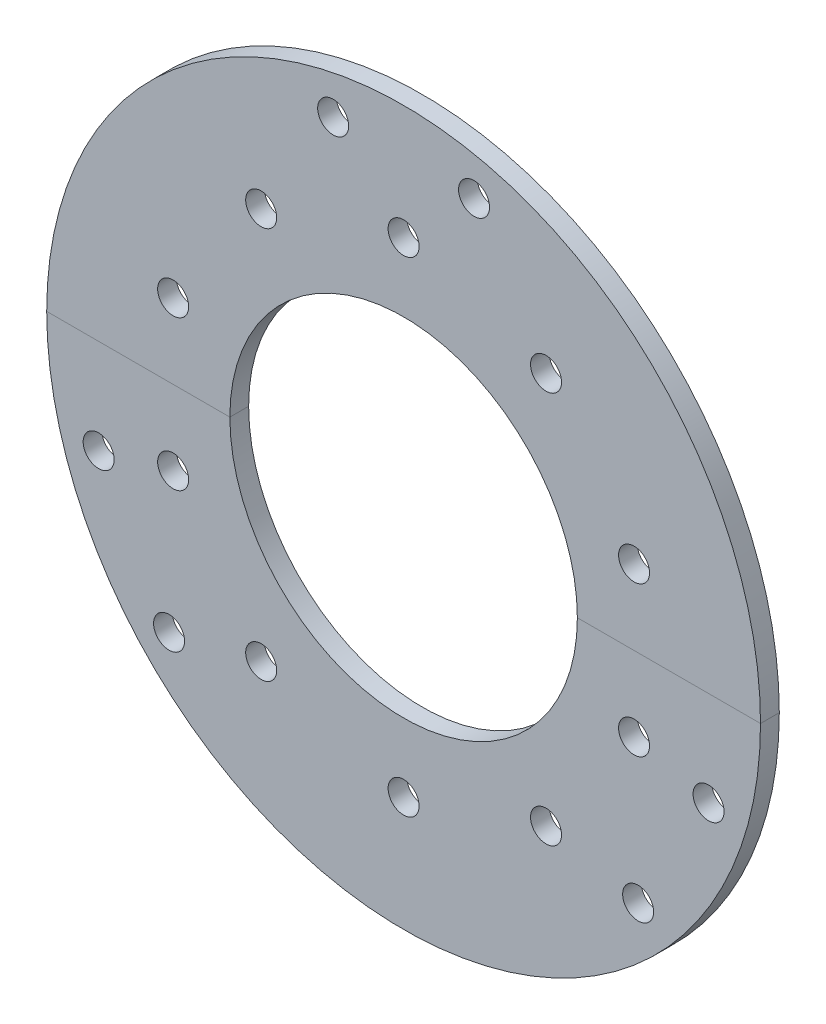
ISO-10303-21;
HEADER;
FILE_DESCRIPTION(('STEP AP214'),'2;1');
FILE_NAME('part.step','',(''),(''),'','','');
FILE_SCHEMA(('AUTOMOTIVE_DESIGN { 1 0 10303 214 1 1 1 1 }'));
ENDSEC;
DATA;
#1=APPLICATION_CONTEXT('core data for automotive mechanical design processes');
#2=APPLICATION_PROTOCOL_DEFINITION('international standard','automotive_design',2000,#1);
#3=PRODUCT_CONTEXT('',#1,'mechanical');
#4=PRODUCT('Part','Part','',(#3));
#5=PRODUCT_RELATED_PRODUCT_CATEGORY('part','',(#4));
#6=PRODUCT_DEFINITION_FORMATION('','',#4);
#7=PRODUCT_DEFINITION_CONTEXT('part definition',#1,'design');
#8=PRODUCT_DEFINITION('design','',#6,#7);
#9=PRODUCT_DEFINITION_SHAPE('','',#8);
#10=(LENGTH_UNIT() NAMED_UNIT(*) SI_UNIT(.MILLI.,.METRE.));
#11=(NAMED_UNIT(*) PLANE_ANGLE_UNIT() SI_UNIT($,.RADIAN.));
#12=(NAMED_UNIT(*) SI_UNIT($,.STERADIAN.) SOLID_ANGLE_UNIT());
#13=UNCERTAINTY_MEASURE_WITH_UNIT(LENGTH_MEASURE(1.E-05),#10,'distance_accuracy_value','');
#14=(GEOMETRIC_REPRESENTATION_CONTEXT(3) GLOBAL_UNCERTAINTY_ASSIGNED_CONTEXT((#13)) GLOBAL_UNIT_ASSIGNED_CONTEXT((#10,
#11,#12)) REPRESENTATION_CONTEXT('',''));
#15=CARTESIAN_POINT('',(0.,0.,0.));
#16=DIRECTION('',(0.,0.,1.));
#17=DIRECTION('',(1.,0.,0.));
#18=AXIS2_PLACEMENT_3D('',#15,#16,#17);
#19=CARTESIAN_POINT('',(0.,0.,0.));
#20=DIRECTION('',(0.,1.,0.));
#21=DIRECTION('',(0.,0.,1.));
#22=AXIS2_PLACEMENT_3D('',#19,#20,#21);
#23=PLANE('',#22);
#24=DIRECTION('',(-1.,0.,0.));
#25=VECTOR('',#24,1.);
#26=CARTESIAN_POINT('',(0.,0.,4.));
#27=LINE('',#26,#25);
#28=CARTESIAN_POINT('',(76.,0.,4.));
#29=VERTEX_POINT('',#28);
#30=CARTESIAN_POINT('',(37.,0.,4.));
#31=VERTEX_POINT('',#30);
#32=EDGE_CURVE('E99',#29,#31,#27,.T.);
#33=ORIENTED_EDGE('',*,*,#32,.F.);
#34=DIRECTION('',(0.,0.,-1.));
#35=VECTOR('',#34,1.);
#36=CARTESIAN_POINT('',(76.,0.,4.));
#37=LINE('',#36,#35);
#38=CARTESIAN_POINT('',(76.,0.,0.));
#39=VERTEX_POINT('',#38);
#40=EDGE_CURVE('E109',#29,#39,#37,.T.);
#41=ORIENTED_EDGE('',*,*,#40,.T.);
#42=DIRECTION('',(-1.,0.,0.));
#43=VECTOR('',#42,1.);
#44=CARTESIAN_POINT('',(0.,0.,0.));
#45=LINE('',#44,#43);
#46=CARTESIAN_POINT('',(37.,0.,0.));
#47=VERTEX_POINT('',#46);
#48=EDGE_CURVE('E111',#39,#47,#45,.T.);
#49=ORIENTED_EDGE('',*,*,#48,.T.);
#50=DIRECTION('',(0.,0.,-1.));
#51=VECTOR('',#50,1.);
#52=CARTESIAN_POINT('',(37.,0.,4.));
#53=LINE('',#52,#51);
#54=EDGE_CURVE('E69',#31,#47,#53,.T.);
#55=ORIENTED_EDGE('',*,*,#54,.F.);
#56=EDGE_LOOP('',(#33,#41,#49,#55));
#57=FACE_BOUND('',#56,.T.);
#58=ADVANCED_FACE('F51',(#57),#23,.T.);
#59=CARTESIAN_POINT('',(-37.,0.,0.));
#60=VERTEX_POINT('',#59);
#61=CARTESIAN_POINT('',(-76.,0.,0.));
#62=VERTEX_POINT('',#61);
#63=EDGE_CURVE('E116',#60,#62,#45,.T.);
#64=ORIENTED_EDGE('',*,*,#63,.T.);
#65=DIRECTION('',(0.,0.,-1.));
#66=VECTOR('',#65,1.);
#67=CARTESIAN_POINT('',(-76.,0.,4.));
#68=LINE('',#67,#66);
#69=CARTESIAN_POINT('',(-76.,0.,4.));
#70=VERTEX_POINT('',#69);
#71=EDGE_CURVE('E117',#62,#70,#68,.F.);
#72=ORIENTED_EDGE('',*,*,#71,.T.);
#73=CARTESIAN_POINT('',(-37.,0.,4.));
#74=VERTEX_POINT('',#73);
#75=EDGE_CURVE('E100',#74,#70,#27,.T.);
#76=ORIENTED_EDGE('',*,*,#75,.F.);
#77=DIRECTION('',(0.,0.,-1.));
#78=VECTOR('',#77,1.);
#79=CARTESIAN_POINT('',(-37.,0.,4.));
#80=LINE('',#79,#78);
#81=EDGE_CURVE('E77',#60,#74,#80,.F.);
#82=ORIENTED_EDGE('',*,*,#81,.F.);
#83=EDGE_LOOP('',(#64,#72,#76,#82));
#84=FACE_BOUND('',#83,.T.);
#85=ADVANCED_FACE('F229',(#84),#23,.T.);
#86=CARTESIAN_POINT('',(49.0745162408297,-15.9452769097482,4.));
#87=DIRECTION('',(0.,0.,-1.));
#88=DIRECTION('',(-1.,0.,0.));
#89=AXIS2_PLACEMENT_3D('',#86,#87,#88);
#90=CYLINDRICAL_SURFACE('',#89,3.3);
#91=CARTESIAN_POINT('',(49.0745162408297,-15.9452769097482,4.));
#92=DIRECTION('',(0.,0.,1.));
#93=DIRECTION('',(1.,0.,0.));
#94=AXIS2_PLACEMENT_3D('',#91,#92,#93);
#95=CIRCLE('',#94,3.3);
#96=CARTESIAN_POINT('',(52.3745162408296,-15.9452769097482,4.));
#97=VERTEX_POINT('',#96);
#98=EDGE_CURVE('E134',#97,#97,#95,.T.);
#99=ORIENTED_EDGE('',*,*,#98,.T.);
#100=EDGE_LOOP('',(#99));
#101=FACE_BOUND('',#100,.T.);
#102=CARTESIAN_POINT('',(49.0745162408297,-15.9452769097482,0.));
#103=DIRECTION('',(0.,0.,1.));
#104=DIRECTION('',(1.,0.,0.));
#105=AXIS2_PLACEMENT_3D('',#102,#103,#104);
#106=CIRCLE('',#105,3.3);
#107=CARTESIAN_POINT('',(52.3745162408296,-15.9452769097482,0.));
#108=VERTEX_POINT('',#107);
#109=EDGE_CURVE('E141',#108,#108,#106,.T.);
#110=ORIENTED_EDGE('',*,*,#109,.F.);
#111=EDGE_LOOP('',(#110));
#112=FACE_BOUND('',#111,.T.);
#113=ADVANCED_FACE('F231',(#101,#112),#90,.F.);
#114=CARTESIAN_POINT('',(30.3297190182908,-41.7452769097479,4.));
#115=DIRECTION('',(0.,0.,-1.));
#116=DIRECTION('',(-1.,0.,0.));
#117=AXIS2_PLACEMENT_3D('',#114,#115,#116);
#118=CYLINDRICAL_SURFACE('',#117,3.29999999999999);
#119=CARTESIAN_POINT('',(30.3297190182908,-41.7452769097479,4.));
#120=DIRECTION('',(0.,0.,1.));
#121=DIRECTION('',(1.,0.,0.));
#122=AXIS2_PLACEMENT_3D('',#119,#120,#121);
#123=CIRCLE('',#122,3.29999999999999);
#124=CARTESIAN_POINT('',(33.6297190182908,-41.7452769097479,4.));
#125=VERTEX_POINT('',#124);
#126=EDGE_CURVE('E149',#125,#125,#123,.T.);
#127=ORIENTED_EDGE('',*,*,#126,.T.);
#128=EDGE_LOOP('',(#127));
#129=FACE_BOUND('',#128,.T.);
#130=CARTESIAN_POINT('',(30.3297190182908,-41.7452769097479,0.));
#131=DIRECTION('',(0.,0.,1.));
#132=DIRECTION('',(1.,0.,0.));
#133=AXIS2_PLACEMENT_3D('',#130,#131,#132);
#134=CIRCLE('',#133,3.29999999999999);
#135=CARTESIAN_POINT('',(33.6297190182908,-41.7452769097479,0.));
#136=VERTEX_POINT('',#135);
#137=EDGE_CURVE('E152',#136,#136,#134,.T.);
#138=ORIENTED_EDGE('',*,*,#137,.F.);
#139=EDGE_LOOP('',(#138));
#140=FACE_BOUND('',#139,.T.);
#141=ADVANCED_FACE('F237',(#129,#140),#118,.F.);
#142=CARTESIAN_POINT('',(-1.06165076729781E-12,-51.6,4.));
#143=DIRECTION('',(0.,0.,-1.));
#144=DIRECTION('',(-1.,0.,0.));
#145=AXIS2_PLACEMENT_3D('',#142,#143,#144);
#146=CYLINDRICAL_SURFACE('',#145,3.30000000000001);
#147=CARTESIAN_POINT('',(-1.06165076729781E-12,-51.6,4.));
#148=DIRECTION('',(0.,0.,1.));
#149=DIRECTION('',(1.,0.,0.));
#150=AXIS2_PLACEMENT_3D('',#147,#148,#149);
#151=CIRCLE('',#150,3.30000000000001);
#152=CARTESIAN_POINT('',(3.29999999999894,-51.6,4.));
#153=VERTEX_POINT('',#152);
#154=EDGE_CURVE('E156',#153,#153,#151,.T.);
#155=ORIENTED_EDGE('',*,*,#154,.T.);
#156=EDGE_LOOP('',(#155));
#157=FACE_BOUND('',#156,.T.);
#158=CARTESIAN_POINT('',(-1.06165076729781E-12,-51.6,0.));
#159=DIRECTION('',(0.,0.,1.));
#160=DIRECTION('',(1.,0.,0.));
#161=AXIS2_PLACEMENT_3D('',#158,#159,#160);
#162=CIRCLE('',#161,3.30000000000001);
#163=CARTESIAN_POINT('',(3.29999999999894,-51.6,0.));
#164=VERTEX_POINT('',#163);
#165=EDGE_CURVE('E160',#164,#164,#162,.T.);
#166=ORIENTED_EDGE('',*,*,#165,.F.);
#167=EDGE_LOOP('',(#166));
#168=FACE_BOUND('',#167,.T.);
#169=ADVANCED_FACE('F306',(#157,#168),#146,.F.);
#170=CARTESIAN_POINT('',(-30.329719018292,-41.7452769097471,4.));
#171=DIRECTION('',(0.,0.,-1.));
#172=DIRECTION('',(-1.,0.,0.));
#173=AXIS2_PLACEMENT_3D('',#170,#171,#172);
#174=CYLINDRICAL_SURFACE('',#173,3.3);
#175=CARTESIAN_POINT('',(-30.329719018292,-41.7452769097471,4.));
#176=DIRECTION('',(0.,0.,1.));
#177=DIRECTION('',(1.,0.,0.));
#178=AXIS2_PLACEMENT_3D('',#175,#176,#177);
#179=CIRCLE('',#178,3.3);
#180=CARTESIAN_POINT('',(-27.029719018292,-41.7452769097471,4.));
#181=VERTEX_POINT('',#180);
#182=EDGE_CURVE('E164',#181,#181,#179,.T.);
#183=ORIENTED_EDGE('',*,*,#182,.T.);
#184=EDGE_LOOP('',(#183));
#185=FACE_BOUND('',#184,.T.);
#186=CARTESIAN_POINT('',(-30.329719018292,-41.7452769097471,0.));
#187=DIRECTION('',(0.,0.,1.));
#188=DIRECTION('',(1.,0.,0.));
#189=AXIS2_PLACEMENT_3D('',#186,#187,#188);
#190=CIRCLE('',#189,3.3);
#191=CARTESIAN_POINT('',(-27.029719018292,-41.7452769097471,0.));
#192=VERTEX_POINT('',#191);
#193=EDGE_CURVE('E168',#192,#192,#190,.T.);
#194=ORIENTED_EDGE('',*,*,#193,.F.);
#195=EDGE_LOOP('',(#194));
#196=FACE_BOUND('',#195,.T.);
#197=ADVANCED_FACE('F298',(#185,#196),#174,.F.);
#198=CARTESIAN_POINT('',(-49.0745162408299,-15.9452769097473,4.));
#199=DIRECTION('',(0.,0.,-1.));
#200=DIRECTION('',(-1.,0.,0.));
#201=AXIS2_PLACEMENT_3D('',#198,#199,#200);
#202=CYLINDRICAL_SURFACE('',#201,3.29999999999998);
#203=CARTESIAN_POINT('',(-49.0745162408299,-15.9452769097473,4.));
#204=DIRECTION('',(0.,0.,1.));
#205=DIRECTION('',(1.,0.,0.));
#206=AXIS2_PLACEMENT_3D('',#203,#204,#205);
#207=CIRCLE('',#206,3.29999999999998);
#208=CARTESIAN_POINT('',(-45.7745162408299,-15.9452769097473,4.));
#209=VERTEX_POINT('',#208);
#210=EDGE_CURVE('E172',#209,#209,#207,.T.);
#211=ORIENTED_EDGE('',*,*,#210,.T.);
#212=EDGE_LOOP('',(#211));
#213=FACE_BOUND('',#212,.T.);
#214=CARTESIAN_POINT('',(-49.0745162408299,-15.9452769097473,0.));
#215=DIRECTION('',(0.,0.,1.));
#216=DIRECTION('',(1.,0.,0.));
#217=AXIS2_PLACEMENT_3D('',#214,#215,#216);
#218=CIRCLE('',#217,3.29999999999998);
#219=CARTESIAN_POINT('',(-45.7745162408299,-15.9452769097473,0.));
#220=VERTEX_POINT('',#219);
#221=EDGE_CURVE('E176',#220,#220,#218,.T.);
#222=ORIENTED_EDGE('',*,*,#221,.F.);
#223=EDGE_LOOP('',(#222));
#224=FACE_BOUND('',#223,.T.);
#225=ADVANCED_FACE('F290',(#213,#224),#202,.F.);
#226=CARTESIAN_POINT('',(64.9390981823357,-20.1720977408143,4.));
#227=DIRECTION('',(0.,0.,-1.));
#228=DIRECTION('',(-1.,0.,0.));
#229=AXIS2_PLACEMENT_3D('',#226,#227,#228);
#230=CYLINDRICAL_SURFACE('',#229,3.30000000000001);
#231=CARTESIAN_POINT('',(64.9390981823357,-20.1720977408143,4.));
#232=DIRECTION('',(0.,0.,1.));
#233=DIRECTION('',(1.,0.,0.));
#234=AXIS2_PLACEMENT_3D('',#231,#232,#233);
#235=CIRCLE('',#234,3.30000000000001);
#236=CARTESIAN_POINT('',(68.2390981823357,-20.1720977408143,4.));
#237=VERTEX_POINT('',#236);
#238=EDGE_CURVE('E180',#237,#237,#235,.T.);
#239=ORIENTED_EDGE('',*,*,#238,.T.);
#240=EDGE_LOOP('',(#239));
#241=FACE_BOUND('',#240,.T.);
#242=CARTESIAN_POINT('',(64.9390981823357,-20.1720977408143,0.));
#243=DIRECTION('',(0.,0.,1.));
#244=DIRECTION('',(1.,0.,0.));
#245=AXIS2_PLACEMENT_3D('',#242,#243,#244);
#246=CIRCLE('',#245,3.30000000000001);
#247=CARTESIAN_POINT('',(68.2390981823357,-20.1720977408143,0.));
#248=VERTEX_POINT('',#247);
#249=EDGE_CURVE('E184',#248,#248,#246,.T.);
#250=ORIENTED_EDGE('',*,*,#249,.F.);
#251=EDGE_LOOP('',(#250));
#252=FACE_BOUND('',#251,.T.);
#253=ADVANCED_FACE('F282',(#241,#252),#230,.F.);
#254=CARTESIAN_POINT('',(49.9390981823357,-46.1528598543474,4.));
#255=DIRECTION('',(0.,0.,-1.));
#256=DIRECTION('',(-1.,0.,0.));
#257=AXIS2_PLACEMENT_3D('',#254,#255,#256);
#258=CYLINDRICAL_SURFACE('',#257,3.3);
#259=CARTESIAN_POINT('',(49.9390981823357,-46.1528598543474,4.));
#260=DIRECTION('',(0.,0.,1.));
#261=DIRECTION('',(1.,0.,0.));
#262=AXIS2_PLACEMENT_3D('',#259,#260,#261);
#263=CIRCLE('',#262,3.3);
#264=CARTESIAN_POINT('',(53.2390981823357,-46.1528598543474,4.));
#265=VERTEX_POINT('',#264);
#266=EDGE_CURVE('E188',#265,#265,#263,.T.);
#267=ORIENTED_EDGE('',*,*,#266,.T.);
#268=EDGE_LOOP('',(#267));
#269=FACE_BOUND('',#268,.T.);
#270=CARTESIAN_POINT('',(49.9390981823357,-46.1528598543474,0.));
#271=DIRECTION('',(0.,0.,1.));
#272=DIRECTION('',(1.,0.,0.));
#273=AXIS2_PLACEMENT_3D('',#270,#271,#272);
#274=CIRCLE('',#273,3.3);
#275=CARTESIAN_POINT('',(53.2390981823357,-46.1528598543474,0.));
#276=VERTEX_POINT('',#275);
#277=EDGE_CURVE('E192',#276,#276,#274,.T.);
#278=ORIENTED_EDGE('',*,*,#277,.F.);
#279=EDGE_LOOP('',(#278));
#280=FACE_BOUND('',#279,.T.);
#281=ADVANCED_FACE('F275',(#269,#280),#258,.F.);
#282=CARTESIAN_POINT('',(-49.9390981823357,-46.1528598543475,4.));
#283=DIRECTION('',(0.,0.,-1.));
#284=DIRECTION('',(-1.,0.,0.));
#285=AXIS2_PLACEMENT_3D('',#282,#283,#284);
#286=CYLINDRICAL_SURFACE('',#285,3.3);
#287=CARTESIAN_POINT('',(-49.9390981823357,-46.1528598543475,4.));
#288=DIRECTION('',(0.,0.,1.));
#289=DIRECTION('',(1.,0.,0.));
#290=AXIS2_PLACEMENT_3D('',#287,#288,#289);
#291=CIRCLE('',#290,3.3);
#292=CARTESIAN_POINT('',(-46.6390981823357,-46.1528598543475,4.));
#293=VERTEX_POINT('',#292);
#294=EDGE_CURVE('E196',#293,#293,#291,.T.);
#295=ORIENTED_EDGE('',*,*,#294,.T.);
#296=EDGE_LOOP('',(#295));
#297=FACE_BOUND('',#296,.T.);
#298=CARTESIAN_POINT('',(-49.9390981823357,-46.1528598543475,0.));
#299=DIRECTION('',(0.,0.,1.));
#300=DIRECTION('',(1.,0.,0.));
#301=AXIS2_PLACEMENT_3D('',#298,#299,#300);
#302=CIRCLE('',#301,3.3);
#303=CARTESIAN_POINT('',(-46.6390981823357,-46.1528598543475,0.));
#304=VERTEX_POINT('',#303);
#305=EDGE_CURVE('E200',#304,#304,#302,.T.);
#306=ORIENTED_EDGE('',*,*,#305,.F.);
#307=EDGE_LOOP('',(#306));
#308=FACE_BOUND('',#307,.T.);
#309=ADVANCED_FACE('F268',(#297,#308),#286,.F.);
#310=CARTESIAN_POINT('',(-64.9390981823357,-20.1720977408143,4.));
#311=DIRECTION('',(0.,0.,-1.));
#312=DIRECTION('',(-1.,0.,0.));
#313=AXIS2_PLACEMENT_3D('',#310,#311,#312);
#314=CYLINDRICAL_SURFACE('',#313,3.3);
#315=CARTESIAN_POINT('',(-64.9390981823357,-20.1720977408143,4.));
#316=DIRECTION('',(0.,0.,1.));
#317=DIRECTION('',(1.,0.,0.));
#318=AXIS2_PLACEMENT_3D('',#315,#316,#317);
#319=CIRCLE('',#318,3.3);
#320=CARTESIAN_POINT('',(-61.6390981823357,-20.1720977408143,4.));
#321=VERTEX_POINT('',#320);
#322=EDGE_CURVE('E61',#321,#321,#319,.T.);
#323=ORIENTED_EDGE('',*,*,#322,.T.);
#324=EDGE_LOOP('',(#323));
#325=FACE_BOUND('',#324,.T.);
#326=CARTESIAN_POINT('',(-64.9390981823357,-20.1720977408143,0.));
#327=DIRECTION('',(0.,0.,1.));
#328=DIRECTION('',(1.,0.,0.));
#329=AXIS2_PLACEMENT_3D('',#326,#327,#328);
#330=CIRCLE('',#329,3.3);
#331=CARTESIAN_POINT('',(-61.6390981823357,-20.1720977408143,0.));
#332=VERTEX_POINT('',#331);
#333=EDGE_CURVE('E13',#332,#332,#330,.T.);
#334=ORIENTED_EDGE('',*,*,#333,.F.);
#335=EDGE_LOOP('',(#334));
#336=FACE_BOUND('',#335,.T.);
#337=ADVANCED_FACE('F241',(#325,#336),#314,.F.);
#338=CARTESIAN_POINT('',(0.,0.,0.));
#339=DIRECTION('',(0.,0.,1.));
#340=DIRECTION('',(1.,0.,0.));
#341=AXIS2_PLACEMENT_3D('',#338,#339,#340);
#342=PLANE('',#341);
#343=ORIENTED_EDGE('',*,*,#333,.T.);
#344=EDGE_LOOP('',(#343));
#345=FACE_BOUND('',#344,.T.);
#346=ORIENTED_EDGE('',*,*,#305,.T.);
#347=EDGE_LOOP('',(#346));
#348=FACE_BOUND('',#347,.T.);
#349=ORIENTED_EDGE('',*,*,#277,.T.);
#350=EDGE_LOOP('',(#349));
#351=FACE_BOUND('',#350,.T.);
#352=ORIENTED_EDGE('',*,*,#249,.T.);
#353=EDGE_LOOP('',(#352));
#354=FACE_BOUND('',#353,.T.);
#355=ORIENTED_EDGE('',*,*,#221,.T.);
#356=EDGE_LOOP('',(#355));
#357=FACE_BOUND('',#356,.T.);
#358=ORIENTED_EDGE('',*,*,#193,.T.);
#359=EDGE_LOOP('',(#358));
#360=FACE_BOUND('',#359,.T.);
#361=ORIENTED_EDGE('',*,*,#165,.T.);
#362=EDGE_LOOP('',(#361));
#363=FACE_BOUND('',#362,.T.);
#364=ORIENTED_EDGE('',*,*,#137,.T.);
#365=EDGE_LOOP('',(#364));
#366=FACE_BOUND('',#365,.T.);
#367=ORIENTED_EDGE('',*,*,#109,.T.);
#368=EDGE_LOOP('',(#367));
#369=FACE_BOUND('',#368,.T.);
#370=ORIENTED_EDGE('',*,*,#48,.F.);
#371=CARTESIAN_POINT('',(0.,0.,0.));
#372=DIRECTION('',(0.,0.,1.));
#373=DIRECTION('',(1.,0.,0.));
#374=AXIS2_PLACEMENT_3D('',#371,#372,#373);
#375=CIRCLE('',#374,76.);
#376=EDGE_CURVE('E106',#62,#39,#375,.T.);
#377=ORIENTED_EDGE('',*,*,#376,.F.);
#378=ORIENTED_EDGE('',*,*,#63,.F.);
#379=CARTESIAN_POINT('',(0.,0.,0.));
#380=DIRECTION('',(0.,0.,1.));
#381=DIRECTION('',(1.,0.,0.));
#382=AXIS2_PLACEMENT_3D('',#379,#380,#381);
#383=CIRCLE('',#382,37.);
#384=EDGE_CURVE('E55',#60,#47,#383,.T.);
#385=ORIENTED_EDGE('',*,*,#384,.T.);
#386=EDGE_LOOP('',(#370,#377,#378,#385));
#387=FACE_BOUND('',#386,.T.);
#388=ADVANCED_FACE('F227',(#345,#348,#351,#354,#357,#360,#363,#366,#369,#387),#342,.F.);
#389=CARTESIAN_POINT('',(0.,0.,4.));
#390=DIRECTION('',(0.,0.,1.));
#391=DIRECTION('',(1.,0.,0.));
#392=AXIS2_PLACEMENT_3D('',#389,#390,#391);
#393=PLANE('',#392);
#394=ORIENTED_EDGE('',*,*,#322,.F.);
#395=EDGE_LOOP('',(#394));
#396=FACE_BOUND('',#395,.T.);
#397=ORIENTED_EDGE('',*,*,#266,.F.);
#398=EDGE_LOOP('',(#397));
#399=FACE_BOUND('',#398,.T.);
#400=ORIENTED_EDGE('',*,*,#210,.F.);
#401=EDGE_LOOP('',(#400));
#402=FACE_BOUND('',#401,.T.);
#403=ORIENTED_EDGE('',*,*,#154,.F.);
#404=EDGE_LOOP('',(#403));
#405=FACE_BOUND('',#404,.T.);
#406=ORIENTED_EDGE('',*,*,#98,.F.);
#407=EDGE_LOOP('',(#406));
#408=FACE_BOUND('',#407,.T.);
#409=ORIENTED_EDGE('',*,*,#126,.F.);
#410=EDGE_LOOP('',(#409));
#411=FACE_BOUND('',#410,.T.);
#412=ORIENTED_EDGE('',*,*,#182,.F.);
#413=EDGE_LOOP('',(#412));
#414=FACE_BOUND('',#413,.T.);
#415=ORIENTED_EDGE('',*,*,#238,.F.);
#416=EDGE_LOOP('',(#415));
#417=FACE_BOUND('',#416,.T.);
#418=ORIENTED_EDGE('',*,*,#294,.F.);
#419=EDGE_LOOP('',(#418));
#420=FACE_BOUND('',#419,.T.);
#421=CARTESIAN_POINT('',(0.,0.,4.));
#422=DIRECTION('',(0.,0.,1.));
#423=DIRECTION('',(1.,0.,0.));
#424=AXIS2_PLACEMENT_3D('',#421,#422,#423);
#425=CIRCLE('',#424,76.);
#426=EDGE_CURVE('E96',#70,#29,#425,.T.);
#427=ORIENTED_EDGE('',*,*,#426,.T.);
#428=ORIENTED_EDGE('',*,*,#32,.T.);
#429=CARTESIAN_POINT('',(0.,0.,4.));
#430=DIRECTION('',(0.,0.,1.));
#431=DIRECTION('',(1.,0.,0.));
#432=AXIS2_PLACEMENT_3D('',#429,#430,#431);
#433=CIRCLE('',#432,37.);
#434=EDGE_CURVE('E128',#74,#31,#433,.T.);
#435=ORIENTED_EDGE('',*,*,#434,.F.);
#436=ORIENTED_EDGE('',*,*,#75,.T.);
#437=EDGE_LOOP('',(#427,#428,#435,#436));
#438=FACE_BOUND('',#437,.T.);
#439=ADVANCED_FACE('F97',(#396,#399,#402,#405,#408,#411,#414,#417,#420,#438),#393,.T.);
#440=CARTESIAN_POINT('',(0.,0.,4.));
#441=DIRECTION('',(0.,0.,-1.));
#442=DIRECTION('',(-1.,0.,0.));
#443=AXIS2_PLACEMENT_3D('',#440,#441,#442);
#444=CYLINDRICAL_SURFACE('',#443,37.);
#445=ORIENTED_EDGE('',*,*,#434,.T.);
#446=ORIENTED_EDGE('',*,*,#54,.T.);
#447=ORIENTED_EDGE('',*,*,#384,.F.);
#448=ORIENTED_EDGE('',*,*,#81,.T.);
#449=EDGE_LOOP('',(#445,#446,#447,#448));
#450=FACE_BOUND('',#449,.T.);
#451=ADVANCED_FACE('F53',(#450),#444,.F.);
#452=CARTESIAN_POINT('',(0.,0.,4.));
#453=DIRECTION('',(0.,0.,-1.));
#454=DIRECTION('',(-1.,0.,0.));
#455=AXIS2_PLACEMENT_3D('',#452,#453,#454);
#456=CYLINDRICAL_SURFACE('',#455,76.);
#457=ORIENTED_EDGE('',*,*,#40,.F.);
#458=ORIENTED_EDGE('',*,*,#426,.F.);
#459=ORIENTED_EDGE('',*,*,#71,.F.);
#460=ORIENTED_EDGE('',*,*,#376,.T.);
#461=EDGE_LOOP('',(#457,#458,#459,#460));
#462=FACE_BOUND('',#461,.T.);
#463=ADVANCED_FACE('F113',(#462),#456,.T.);
#464=CLOSED_SHELL('',(#58,#85,#113,#141,#169,#197,#225,#253,#281,#309,#337,#388,#439,#451,#463));
#465=MANIFOLD_SOLID_BREP('B2',#464);
#466=CARTESIAN_POINT('',(0.,0.,0.));
#467=DIRECTION('',(0.,1.,0.));
#468=DIRECTION('',(0.,0.,1.));
#469=AXIS2_PLACEMENT_3D('',#466,#467,#468);
#470=PLANE('',#469);
#471=DIRECTION('',(-1.,0.,0.));
#472=VECTOR('',#471,1.);
#473=CARTESIAN_POINT('',(0.,0.,4.));
#474=LINE('',#473,#472);
#475=CARTESIAN_POINT('',(76.,0.,4.));
#476=VERTEX_POINT('',#475);
#477=CARTESIAN_POINT('',(37.,0.,4.));
#478=VERTEX_POINT('',#477);
#479=EDGE_CURVE('E540',#476,#478,#474,.T.);
#480=ORIENTED_EDGE('',*,*,#479,.T.);
#481=DIRECTION('',(0.,0.,-1.));
#482=VECTOR('',#481,1.);
#483=CARTESIAN_POINT('',(37.,0.,4.));
#484=LINE('',#483,#482);
#485=CARTESIAN_POINT('',(37.,0.,0.));
#486=VERTEX_POINT('',#485);
#487=EDGE_CURVE('E504',#478,#486,#484,.T.);
#488=ORIENTED_EDGE('',*,*,#487,.T.);
#489=DIRECTION('',(-1.,0.,0.));
#490=VECTOR('',#489,1.);
#491=CARTESIAN_POINT('',(0.,0.,0.));
#492=LINE('',#491,#490);
#493=CARTESIAN_POINT('',(76.,0.,0.));
#494=VERTEX_POINT('',#493);
#495=EDGE_CURVE('E541',#494,#486,#492,.T.);
#496=ORIENTED_EDGE('',*,*,#495,.F.);
#497=DIRECTION('',(0.,0.,-1.));
#498=VECTOR('',#497,1.);
#499=CARTESIAN_POINT('',(76.,0.,4.));
#500=LINE('',#499,#498);
#501=EDGE_CURVE('E498',#476,#494,#500,.T.);
#502=ORIENTED_EDGE('',*,*,#501,.F.);
#503=EDGE_LOOP('',(#480,#488,#496,#502));
#504=FACE_BOUND('',#503,.T.);
#505=ADVANCED_FACE('F495',(#504),#470,.F.);
#506=CARTESIAN_POINT('',(-37.,0.,0.));
#507=VERTEX_POINT('',#506);
#508=CARTESIAN_POINT('',(-76.,0.,0.));
#509=VERTEX_POINT('',#508);
#510=EDGE_CURVE('E547',#507,#509,#492,.T.);
#511=ORIENTED_EDGE('',*,*,#510,.F.);
#512=DIRECTION('',(0.,0.,-1.));
#513=VECTOR('',#512,1.);
#514=CARTESIAN_POINT('',(-37.,0.,4.));
#515=LINE('',#514,#513);
#516=CARTESIAN_POINT('',(-37.,0.,4.));
#517=VERTEX_POINT('',#516);
#518=EDGE_CURVE('E49',#507,#517,#515,.F.);
#519=ORIENTED_EDGE('',*,*,#518,.T.);
#520=CARTESIAN_POINT('',(-76.,0.,4.));
#521=VERTEX_POINT('',#520);
#522=EDGE_CURVE('E519',#517,#521,#474,.T.);
#523=ORIENTED_EDGE('',*,*,#522,.T.);
#524=DIRECTION('',(0.,0.,-1.));
#525=VECTOR('',#524,1.);
#526=CARTESIAN_POINT('',(-76.,0.,4.));
#527=LINE('',#526,#525);
#528=EDGE_CURVE('E548',#509,#521,#527,.F.);
#529=ORIENTED_EDGE('',*,*,#528,.F.);
#530=EDGE_LOOP('',(#511,#519,#523,#529));
#531=FACE_BOUND('',#530,.T.);
#532=ADVANCED_FACE('F576',(#531),#470,.F.);
#533=CARTESIAN_POINT('',(0.,0.,4.));
#534=DIRECTION('',(0.,0.,1.));
#535=DIRECTION('',(1.,0.,0.));
#536=AXIS2_PLACEMENT_3D('',#533,#534,#535);
#537=PLANE('',#536);
#538=ORIENTED_EDGE('',*,*,#479,.F.);
#539=CARTESIAN_POINT('',(0.,0.,4.));
#540=DIRECTION('',(0.,0.,1.));
#541=DIRECTION('',(1.,0.,0.));
#542=AXIS2_PLACEMENT_3D('',#539,#540,#541);
#543=CIRCLE('',#542,76.);
#544=EDGE_CURVE('E551',#476,#521,#543,.T.);
#545=ORIENTED_EDGE('',*,*,#544,.T.);
#546=ORIENTED_EDGE('',*,*,#522,.F.);
#547=CARTESIAN_POINT('',(0.,0.,4.));
#548=DIRECTION('',(0.,0.,1.));
#549=DIRECTION('',(1.,0.,0.));
#550=AXIS2_PLACEMENT_3D('',#547,#548,#549);
#551=CIRCLE('',#550,37.);
#552=EDGE_CURVE('E552',#478,#517,#551,.T.);
#553=ORIENTED_EDGE('',*,*,#552,.F.);
#554=EDGE_LOOP('',(#538,#545,#546,#553));
#555=FACE_BOUND('',#554,.T.);
#556=CARTESIAN_POINT('',(-15.,66.3249575951617,4.));
#557=DIRECTION('',(0.,0.,1.));
#558=DIRECTION('',(1.,0.,0.));
#559=AXIS2_PLACEMENT_3D('',#556,#557,#558);
#560=CIRCLE('',#559,3.3);
#561=CARTESIAN_POINT('',(-11.7,66.3249575951617,4.));
#562=VERTEX_POINT('',#561);
#563=EDGE_CURVE('E622',#562,#562,#560,.T.);
#564=ORIENTED_EDGE('',*,*,#563,.F.);
#565=EDGE_LOOP('',(#564));
#566=FACE_BOUND('',#565,.T.);
#567=CARTESIAN_POINT('',(-49.0745162408298,15.9452769097478,4.));
#568=DIRECTION('',(0.,0.,1.));
#569=DIRECTION('',(1.,0.,0.));
#570=AXIS2_PLACEMENT_3D('',#567,#568,#569);
#571=CIRCLE('',#570,3.30000000000029);
#572=CARTESIAN_POINT('',(-45.7745162408295,15.9452769097478,4.));
#573=VERTEX_POINT('',#572);
#574=EDGE_CURVE('E606',#573,#573,#571,.T.);
#575=ORIENTED_EDGE('',*,*,#574,.F.);
#576=EDGE_LOOP('',(#575));
#577=FACE_BOUND('',#576,.T.);
#578=CARTESIAN_POINT('',(49.0745162408302,15.9452769097465,4.));
#579=DIRECTION('',(0.,0.,1.));
#580=DIRECTION('',(1.,0.,0.));
#581=AXIS2_PLACEMENT_3D('',#578,#579,#580);
#582=CIRCLE('',#581,3.3);
#583=CARTESIAN_POINT('',(52.3745162408302,15.9452769097465,4.));
#584=VERTEX_POINT('',#583);
#585=EDGE_CURVE('E598',#584,#584,#582,.T.);
#586=ORIENTED_EDGE('',*,*,#585,.F.);
#587=EDGE_LOOP('',(#586));
#588=FACE_BOUND('',#587,.T.);
#589=CARTESIAN_POINT('',(0.,51.6,4.));
#590=DIRECTION('',(0.,0.,1.));
#591=DIRECTION('',(1.,0.,0.));
#592=AXIS2_PLACEMENT_3D('',#589,#590,#591);
#593=CIRCLE('',#592,3.3);
#594=CARTESIAN_POINT('',(3.3,51.6,4.));
#595=VERTEX_POINT('',#594);
#596=EDGE_CURVE('E584',#595,#595,#593,.T.);
#597=ORIENTED_EDGE('',*,*,#596,.F.);
#598=EDGE_LOOP('',(#597));
#599=FACE_BOUND('',#598,.T.);
#600=CARTESIAN_POINT('',(30.3297190182922,41.7452769097468,4.));
#601=DIRECTION('',(0.,0.,1.));
#602=DIRECTION('',(1.,0.,0.));
#603=AXIS2_PLACEMENT_3D('',#600,#601,#602);
#604=CIRCLE('',#603,3.3);
#605=CARTESIAN_POINT('',(33.6297190182922,41.7452769097468,4.));
#606=VERTEX_POINT('',#605);
#607=EDGE_CURVE('E590',#606,#606,#604,.T.);
#608=ORIENTED_EDGE('',*,*,#607,.F.);
#609=EDGE_LOOP('',(#608));
#610=FACE_BOUND('',#609,.T.);
#611=CARTESIAN_POINT('',(-30.3297190182911,41.7452769097477,4.));
#612=DIRECTION('',(0.,0.,1.));
#613=DIRECTION('',(1.,0.,0.));
#614=AXIS2_PLACEMENT_3D('',#611,#612,#613);
#615=CIRCLE('',#614,3.30000000000001);
#616=CARTESIAN_POINT('',(-27.0297190182911,41.7452769097477,4.));
#617=VERTEX_POINT('',#616);
#618=EDGE_CURVE('E614',#617,#617,#615,.T.);
#619=ORIENTED_EDGE('',*,*,#618,.F.);
#620=EDGE_LOOP('',(#619));
#621=FACE_BOUND('',#620,.T.);
#622=CARTESIAN_POINT('',(15.,66.3249575951617,4.));
#623=DIRECTION('',(0.,0.,1.));
#624=DIRECTION('',(1.,0.,0.));
#625=AXIS2_PLACEMENT_3D('',#622,#623,#624);
#626=CIRCLE('',#625,3.3);
#627=CARTESIAN_POINT('',(18.3,66.3249575951617,4.));
#628=VERTEX_POINT('',#627);
#629=EDGE_CURVE('E630',#628,#628,#626,.T.);
#630=ORIENTED_EDGE('',*,*,#629,.F.);
#631=EDGE_LOOP('',(#630));
#632=FACE_BOUND('',#631,.T.);
#633=ADVANCED_FACE('F549',(#555,#566,#577,#588,#599,#610,#621,#632),#537,.T.);
#634=CARTESIAN_POINT('',(0.,0.,0.));
#635=DIRECTION('',(0.,0.,1.));
#636=DIRECTION('',(1.,0.,0.));
#637=AXIS2_PLACEMENT_3D('',#634,#635,#636);
#638=PLANE('',#637);
#639=CARTESIAN_POINT('',(0.,0.,0.));
#640=DIRECTION('',(0.,0.,1.));
#641=DIRECTION('',(1.,0.,0.));
#642=AXIS2_PLACEMENT_3D('',#639,#640,#641);
#643=CIRCLE('',#642,76.);
#644=EDGE_CURVE('E557',#494,#509,#643,.T.);
#645=ORIENTED_EDGE('',*,*,#644,.F.);
#646=ORIENTED_EDGE('',*,*,#495,.T.);
#647=CARTESIAN_POINT('',(0.,0.,0.));
#648=DIRECTION('',(0.,0.,1.));
#649=DIRECTION('',(1.,0.,0.));
#650=AXIS2_PLACEMENT_3D('',#647,#648,#649);
#651=CIRCLE('',#650,37.);
#652=EDGE_CURVE('E565',#486,#507,#651,.T.);
#653=ORIENTED_EDGE('',*,*,#652,.T.);
#654=ORIENTED_EDGE('',*,*,#510,.T.);
#655=EDGE_LOOP('',(#645,#646,#653,#654));
#656=FACE_BOUND('',#655,.T.);
#657=CARTESIAN_POINT('',(0.,51.6,0.));
#658=DIRECTION('',(0.,0.,1.));
#659=DIRECTION('',(1.,0.,0.));
#660=AXIS2_PLACEMENT_3D('',#657,#658,#659);
#661=CIRCLE('',#660,3.3);
#662=CARTESIAN_POINT('',(3.3,51.6,0.));
#663=VERTEX_POINT('',#662);
#664=EDGE_CURVE('E586',#663,#663,#661,.T.);
#665=ORIENTED_EDGE('',*,*,#664,.T.);
#666=EDGE_LOOP('',(#665));
#667=FACE_BOUND('',#666,.T.);
#668=CARTESIAN_POINT('',(30.3297190182922,41.7452769097468,0.));
#669=DIRECTION('',(0.,0.,1.));
#670=DIRECTION('',(1.,0.,0.));
#671=AXIS2_PLACEMENT_3D('',#668,#669,#670);
#672=CIRCLE('',#671,3.3);
#673=CARTESIAN_POINT('',(33.6297190182922,41.7452769097468,0.));
#674=VERTEX_POINT('',#673);
#675=EDGE_CURVE('E594',#674,#674,#672,.T.);
#676=ORIENTED_EDGE('',*,*,#675,.T.);
#677=EDGE_LOOP('',(#676));
#678=FACE_BOUND('',#677,.T.);
#679=CARTESIAN_POINT('',(49.0745162408302,15.9452769097465,0.));
#680=DIRECTION('',(0.,0.,1.));
#681=DIRECTION('',(1.,0.,0.));
#682=AXIS2_PLACEMENT_3D('',#679,#680,#681);
#683=CIRCLE('',#682,3.3);
#684=CARTESIAN_POINT('',(52.3745162408302,15.9452769097465,0.));
#685=VERTEX_POINT('',#684);
#686=EDGE_CURVE('E602',#685,#685,#683,.T.);
#687=ORIENTED_EDGE('',*,*,#686,.T.);
#688=EDGE_LOOP('',(#687));
#689=FACE_BOUND('',#688,.T.);
#690=CARTESIAN_POINT('',(-49.0745162408298,15.9452769097478,0.));
#691=DIRECTION('',(0.,0.,1.));
#692=DIRECTION('',(1.,0.,0.));
#693=AXIS2_PLACEMENT_3D('',#690,#691,#692);
#694=CIRCLE('',#693,3.30000000000029);
#695=CARTESIAN_POINT('',(-45.7745162408295,15.9452769097478,0.));
#696=VERTEX_POINT('',#695);
#697=EDGE_CURVE('E610',#696,#696,#694,.T.);
#698=ORIENTED_EDGE('',*,*,#697,.T.);
#699=EDGE_LOOP('',(#698));
#700=FACE_BOUND('',#699,.T.);
#701=CARTESIAN_POINT('',(-30.3297190182911,41.7452769097477,0.));
#702=DIRECTION('',(0.,0.,1.));
#703=DIRECTION('',(1.,0.,0.));
#704=AXIS2_PLACEMENT_3D('',#701,#702,#703);
#705=CIRCLE('',#704,3.30000000000001);
#706=CARTESIAN_POINT('',(-27.0297190182911,41.7452769097477,0.));
#707=VERTEX_POINT('',#706);
#708=EDGE_CURVE('E618',#707,#707,#705,.T.);
#709=ORIENTED_EDGE('',*,*,#708,.T.);
#710=EDGE_LOOP('',(#709));
#711=FACE_BOUND('',#710,.T.);
#712=CARTESIAN_POINT('',(-15.,66.3249575951617,0.));
#713=DIRECTION('',(0.,0.,1.));
#714=DIRECTION('',(1.,0.,0.));
#715=AXIS2_PLACEMENT_3D('',#712,#713,#714);
#716=CIRCLE('',#715,3.3);
#717=CARTESIAN_POINT('',(-11.7,66.3249575951617,0.));
#718=VERTEX_POINT('',#717);
#719=EDGE_CURVE('E626',#718,#718,#716,.T.);
#720=ORIENTED_EDGE('',*,*,#719,.T.);
#721=EDGE_LOOP('',(#720));
#722=FACE_BOUND('',#721,.T.);
#723=CARTESIAN_POINT('',(15.,66.3249575951617,0.));
#724=DIRECTION('',(0.,0.,1.));
#725=DIRECTION('',(1.,0.,0.));
#726=AXIS2_PLACEMENT_3D('',#723,#724,#725);
#727=CIRCLE('',#726,3.3);
#728=CARTESIAN_POINT('',(18.3,66.3249575951617,0.));
#729=VERTEX_POINT('',#728);
#730=EDGE_CURVE('E634',#729,#729,#727,.T.);
#731=ORIENTED_EDGE('',*,*,#730,.T.);
#732=EDGE_LOOP('',(#731));
#733=FACE_BOUND('',#732,.T.);
#734=ADVANCED_FACE('F648',(#656,#667,#678,#689,#700,#711,#722,#733),#638,.F.);
#735=CARTESIAN_POINT('',(0.,0.,4.));
#736=DIRECTION('',(0.,0.,-1.));
#737=DIRECTION('',(-1.,0.,0.));
#738=AXIS2_PLACEMENT_3D('',#735,#736,#737);
#739=CYLINDRICAL_SURFACE('',#738,76.);
#740=ORIENTED_EDGE('',*,*,#544,.F.);
#741=ORIENTED_EDGE('',*,*,#501,.T.);
#742=ORIENTED_EDGE('',*,*,#644,.T.);
#743=ORIENTED_EDGE('',*,*,#528,.T.);
#744=EDGE_LOOP('',(#740,#741,#742,#743));
#745=FACE_BOUND('',#744,.T.);
#746=ADVANCED_FACE('F555',(#745),#739,.T.);
#747=CARTESIAN_POINT('',(0.,0.,4.));
#748=DIRECTION('',(0.,0.,-1.));
#749=DIRECTION('',(-1.,0.,0.));
#750=AXIS2_PLACEMENT_3D('',#747,#748,#749);
#751=CYLINDRICAL_SURFACE('',#750,37.);
#752=ORIENTED_EDGE('',*,*,#487,.F.);
#753=ORIENTED_EDGE('',*,*,#552,.T.);
#754=ORIENTED_EDGE('',*,*,#518,.F.);
#755=ORIENTED_EDGE('',*,*,#652,.F.);
#756=EDGE_LOOP('',(#752,#753,#754,#755));
#757=FACE_BOUND('',#756,.T.);
#758=ADVANCED_FACE('F579',(#757),#751,.F.);
#759=CARTESIAN_POINT('',(0.,51.6,4.));
#760=DIRECTION('',(0.,0.,-1.));
#761=DIRECTION('',(-1.,0.,0.));
#762=AXIS2_PLACEMENT_3D('',#759,#760,#761);
#763=CYLINDRICAL_SURFACE('',#762,3.3);
#764=ORIENTED_EDGE('',*,*,#596,.T.);
#765=EDGE_LOOP('',(#764));
#766=FACE_BOUND('',#765,.T.);
#767=ORIENTED_EDGE('',*,*,#664,.F.);
#768=EDGE_LOOP('',(#767));
#769=FACE_BOUND('',#768,.T.);
#770=ADVANCED_FACE('F686',(#766,#769),#763,.F.);
#771=CARTESIAN_POINT('',(30.3297190182922,41.7452769097468,4.));
#772=DIRECTION('',(0.,0.,-1.));
#773=DIRECTION('',(-1.,0.,0.));
#774=AXIS2_PLACEMENT_3D('',#771,#772,#773);
#775=CYLINDRICAL_SURFACE('',#774,3.3);
#776=ORIENTED_EDGE('',*,*,#607,.T.);
#777=EDGE_LOOP('',(#776));
#778=FACE_BOUND('',#777,.T.);
#779=ORIENTED_EDGE('',*,*,#675,.F.);
#780=EDGE_LOOP('',(#779));
#781=FACE_BOUND('',#780,.T.);
#782=ADVANCED_FACE('F693',(#778,#781),#775,.F.);
#783=CARTESIAN_POINT('',(49.0745162408302,15.9452769097465,4.));
#784=DIRECTION('',(0.,0.,-1.));
#785=DIRECTION('',(-1.,0.,0.));
#786=AXIS2_PLACEMENT_3D('',#783,#784,#785);
#787=CYLINDRICAL_SURFACE('',#786,3.3);
#788=ORIENTED_EDGE('',*,*,#585,.T.);
#789=EDGE_LOOP('',(#788));
#790=FACE_BOUND('',#789,.T.);
#791=ORIENTED_EDGE('',*,*,#686,.F.);
#792=EDGE_LOOP('',(#791));
#793=FACE_BOUND('',#792,.T.);
#794=ADVANCED_FACE('F702',(#790,#793),#787,.F.);
#795=CARTESIAN_POINT('',(-49.0745162408298,15.9452769097478,4.));
#796=DIRECTION('',(0.,0.,-1.));
#797=DIRECTION('',(-1.,0.,0.));
#798=AXIS2_PLACEMENT_3D('',#795,#796,#797);
#799=CYLINDRICAL_SURFACE('',#798,3.30000000000029);
#800=ORIENTED_EDGE('',*,*,#574,.T.);
#801=EDGE_LOOP('',(#800));
#802=FACE_BOUND('',#801,.T.);
#803=ORIENTED_EDGE('',*,*,#697,.F.);
#804=EDGE_LOOP('',(#803));
#805=FACE_BOUND('',#804,.T.);
#806=ADVANCED_FACE('F711',(#802,#805),#799,.F.);
#807=CARTESIAN_POINT('',(-30.3297190182911,41.7452769097477,4.));
#808=DIRECTION('',(0.,0.,-1.));
#809=DIRECTION('',(-1.,0.,0.));
#810=AXIS2_PLACEMENT_3D('',#807,#808,#809);
#811=CYLINDRICAL_SURFACE('',#810,3.30000000000001);
#812=ORIENTED_EDGE('',*,*,#618,.T.);
#813=EDGE_LOOP('',(#812));
#814=FACE_BOUND('',#813,.T.);
#815=ORIENTED_EDGE('',*,*,#708,.F.);
#816=EDGE_LOOP('',(#815));
#817=FACE_BOUND('',#816,.T.);
#818=ADVANCED_FACE('F720',(#814,#817),#811,.F.);
#819=CARTESIAN_POINT('',(-15.,66.3249575951617,4.));
#820=DIRECTION('',(0.,0.,-1.));
#821=DIRECTION('',(-1.,0.,0.));
#822=AXIS2_PLACEMENT_3D('',#819,#820,#821);
#823=CYLINDRICAL_SURFACE('',#822,3.3);
#824=ORIENTED_EDGE('',*,*,#563,.T.);
#825=EDGE_LOOP('',(#824));
#826=FACE_BOUND('',#825,.T.);
#827=ORIENTED_EDGE('',*,*,#719,.F.);
#828=EDGE_LOOP('',(#827));
#829=FACE_BOUND('',#828,.T.);
#830=ADVANCED_FACE('F729',(#826,#829),#823,.F.);
#831=CARTESIAN_POINT('',(15.,66.3249575951617,4.));
#832=DIRECTION('',(0.,0.,-1.));
#833=DIRECTION('',(-1.,0.,0.));
#834=AXIS2_PLACEMENT_3D('',#831,#832,#833);
#835=CYLINDRICAL_SURFACE('',#834,3.3);
#836=ORIENTED_EDGE('',*,*,#629,.T.);
#837=EDGE_LOOP('',(#836));
#838=FACE_BOUND('',#837,.T.);
#839=ORIENTED_EDGE('',*,*,#730,.F.);
#840=EDGE_LOOP('',(#839));
#841=FACE_BOUND('',#840,.T.);
#842=ADVANCED_FACE('F644',(#838,#841),#835,.F.);
#843=CLOSED_SHELL('',(#505,#532,#633,#734,#746,#758,#770,#782,#794,#806,#818,#830,#842));
#844=MANIFOLD_SOLID_BREP('B7',#843);
#845=ADVANCED_BREP_SHAPE_REPRESENTATION('',(#18,#465,#844),#14);
#846=SHAPE_DEFINITION_REPRESENTATION(#9,#845);
ENDSEC;
END-ISO-10303-21;
